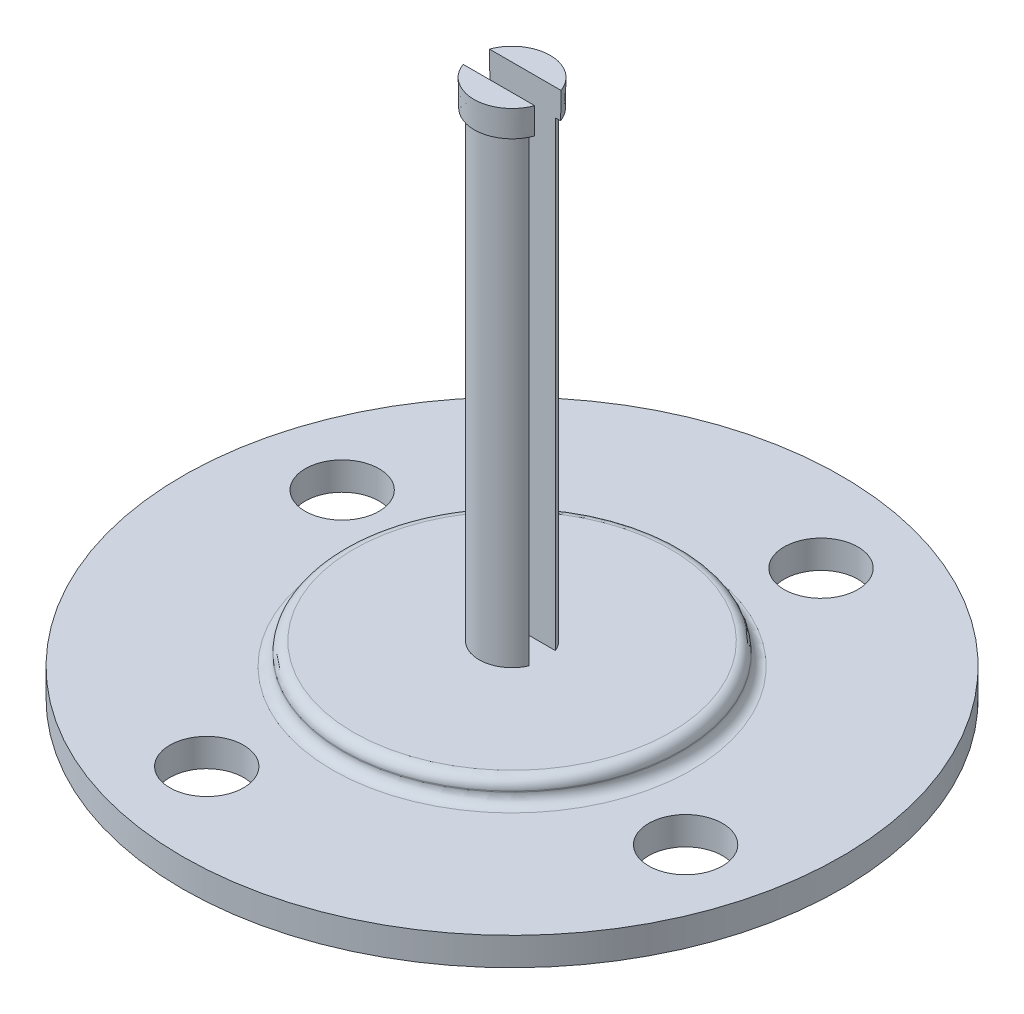
ISO-10303-21;
HEADER;
FILE_DESCRIPTION(('STEP AP214'),'2;1');
FILE_NAME('part.step','',(''),(''),'','','');
FILE_SCHEMA(('AUTOMOTIVE_DESIGN { 1 0 10303 214 1 1 1 1 }'));
ENDSEC;
DATA;
#1=APPLICATION_CONTEXT('core data for automotive mechanical design processes');
#2=APPLICATION_PROTOCOL_DEFINITION('international standard','automotive_design',2000,#1);
#3=PRODUCT_CONTEXT('',#1,'mechanical');
#4=PRODUCT('Part','Part','',(#3));
#5=PRODUCT_RELATED_PRODUCT_CATEGORY('part','',(#4));
#6=PRODUCT_DEFINITION_FORMATION('','',#4);
#7=PRODUCT_DEFINITION_CONTEXT('part definition',#1,'design');
#8=PRODUCT_DEFINITION('design','',#6,#7);
#9=PRODUCT_DEFINITION_SHAPE('','',#8);
#10=(LENGTH_UNIT() NAMED_UNIT(*) SI_UNIT(.MILLI.,.METRE.));
#11=(NAMED_UNIT(*) PLANE_ANGLE_UNIT() SI_UNIT($,.RADIAN.));
#12=(NAMED_UNIT(*) SI_UNIT($,.STERADIAN.) SOLID_ANGLE_UNIT());
#13=UNCERTAINTY_MEASURE_WITH_UNIT(LENGTH_MEASURE(1.E-05),#10,'distance_accuracy_value','');
#14=(GEOMETRIC_REPRESENTATION_CONTEXT(3) GLOBAL_UNCERTAINTY_ASSIGNED_CONTEXT((#13)) GLOBAL_UNIT_ASSIGNED_CONTEXT((#10,
#11,#12)) REPRESENTATION_CONTEXT('',''));
#15=CARTESIAN_POINT('',(0.,0.,0.));
#16=DIRECTION('',(0.,0.,1.));
#17=DIRECTION('',(1.,0.,0.));
#18=AXIS2_PLACEMENT_3D('',#15,#16,#17);
#19=CARTESIAN_POINT('',(-0.172820682432746,49.6391226221658,0.));
#20=DIRECTION('',(0.,1.,0.));
#21=DIRECTION('',(0.,0.,1.));
#22=AXIS2_PLACEMENT_3D('',#19,#20,#21);
#23=PLANE('',#22);
#24=CARTESIAN_POINT('',(-0.172820682432746,49.6391226221658,0.));
#25=DIRECTION('',(0.,1.,0.));
#26=DIRECTION('',(0.,0.,1.));
#27=AXIS2_PLACEMENT_3D('',#24,#25,#26);
#28=CIRCLE('',#27,3.67588377709907);
#29=CARTESIAN_POINT('',(3.27670414611105,49.6391226221658,-1.27));
#30=VERTEX_POINT('',#29);
#31=CARTESIAN_POINT('',(-3.62234551097654,49.6391226221658,-1.27));
#32=VERTEX_POINT('',#31);
#33=EDGE_CURVE('E136',#30,#32,#28,.T.);
#34=ORIENTED_EDGE('',*,*,#33,.T.);
#35=DIRECTION('',(1.,0.,0.));
#36=VECTOR('',#35,1.);
#37=CARTESIAN_POINT('',(-0.172820682432746,49.6391226221658,-1.27));
#38=LINE('',#37,#36);
#39=EDGE_CURVE('E449',#32,#30,#38,.T.);
#40=ORIENTED_EDGE('',*,*,#39,.T.);
#41=EDGE_LOOP('',(#34,#40));
#42=FACE_BOUND('',#41,.T.);
#43=ADVANCED_FACE('F35',(#42),#23,.T.);
#44=CARTESIAN_POINT('',(-0.172820682432746,49.6391226221658,0.));
#45=DIRECTION('',(0.,1.,0.));
#46=DIRECTION('',(0.,0.,1.));
#47=AXIS2_PLACEMENT_3D('',#44,#45,#46);
#48=CONICAL_SURFACE('',#47,3.67588377709907,0.015007533269726);
#49=CARTESIAN_POINT('',(-0.172820682432746,47.0814316097973,0.));
#50=DIRECTION('',(0.,1.,0.));
#51=DIRECTION('',(0.,0.,1.));
#52=AXIS2_PLACEMENT_3D('',#49,#50,#51);
#53=CIRCLE('',#52,3.63749626213781);
#54=CARTESIAN_POINT('',(3.23576833020379,47.0814316097973,-1.27));
#55=VERTEX_POINT('',#54);
#56=CARTESIAN_POINT('',(-3.58140969506929,47.0814316097973,-1.27));
#57=VERTEX_POINT('',#56);
#58=EDGE_CURVE('E132',#55,#57,#53,.T.);
#59=ORIENTED_EDGE('',*,*,#58,.T.);
#60=CARTESIAN_POINT('',(-3.48616510335539,41.1451896661133,-1.27));
#61=CARTESIAN_POINT('',(-3.52475724587845,43.5465206001131,-1.27));
#62=CARTESIAN_POINT('',(-3.563271365335,45.9478527829617,-1.27));
#63=CARTESIAN_POINT('',(-3.64014355811235,50.7505196461857,-1.27));
#64=CARTESIAN_POINT('',(-3.67850163143315,53.1518543265611,-1.27));
#65=CARTESIAN_POINT('',(-3.71678168168746,55.5531902557853,-1.27));
#66=B_SPLINE_CURVE_WITH_KNOTS('',3,(#60,#61,#62,#63,#64,#65),.UNSPECIFIED.,.F.,.F.,(4,2,4),(0.,
7.20492306052159,14.4098461205316),.UNSPECIFIED.);
#67=EDGE_CURVE('E447',#57,#32,#66,.T.);
#68=ORIENTED_EDGE('',*,*,#67,.T.);
#69=ORIENTED_EDGE('',*,*,#33,.F.);
#70=CARTESIAN_POINT('',(3.37114031682196,55.5531902557853,-1.27));
#71=CARTESIAN_POINT('',(3.33286026656766,53.1518543265611,-1.27));
#72=CARTESIAN_POINT('',(3.29450219324685,50.7505196461857,-1.27));
#73=CARTESIAN_POINT('',(3.21763000046951,45.9478527829617,-1.27));
#74=CARTESIAN_POINT('',(3.17911588101296,43.5465206001131,-1.27));
#75=CARTESIAN_POINT('',(3.1405237384899,41.1451896661133,-1.27));
#76=B_SPLINE_CURVE_WITH_KNOTS('',3,(#70,#71,#72,#73,#74,#75),.UNSPECIFIED.,.F.,.F.,(4,2,4),(0.,
7.20492306001003,14.4098461205316),.UNSPECIFIED.);
#77=EDGE_CURVE('E242',#30,#55,#76,.T.);
#78=ORIENTED_EDGE('',*,*,#77,.T.);
#79=EDGE_LOOP('',(#59,#68,#69,#78));
#80=FACE_BOUND('',#79,.T.);
#81=ADVANCED_FACE('F174',(#80),#48,.T.);
#82=CARTESIAN_POINT('',(3.46467557970506,47.0814316097973,0.));
#83=DIRECTION('',(0.,-1.,0.));
#84=DIRECTION('',(0.,0.,-1.));
#85=AXIS2_PLACEMENT_3D('',#82,#83,#84);
#86=PLANE('',#85);
#87=ORIENTED_EDGE('',*,*,#58,.F.);
#88=DIRECTION('',(-1.,0.,0.));
#89=VECTOR('',#88,1.);
#90=CARTESIAN_POINT('',(3.46467557970506,47.0814316097973,-1.27));
#91=LINE('',#90,#89);
#92=CARTESIAN_POINT('',(2.73711488386421,47.0814316097973,-1.27));
#93=VERTEX_POINT('',#92);
#94=EDGE_CURVE('E237',#55,#93,#91,.T.);
#95=ORIENTED_EDGE('',*,*,#94,.T.);
#96=CARTESIAN_POINT('',(-0.172820682432746,47.0814316097973,0.));
#97=DIRECTION('',(0.,1.,0.));
#98=DIRECTION('',(0.,0.,1.));
#99=AXIS2_PLACEMENT_3D('',#96,#97,#98);
#100=CIRCLE('',#99,3.175);
#101=CARTESIAN_POINT('',(-3.08275624872971,47.0814316097973,-1.27));
#102=VERTEX_POINT('',#101);
#103=EDGE_CURVE('E128',#93,#102,#100,.T.);
#104=ORIENTED_EDGE('',*,*,#103,.T.);
#105=EDGE_CURVE('E244',#102,#57,#91,.T.);
#106=ORIENTED_EDGE('',*,*,#105,.T.);
#107=EDGE_LOOP('',(#87,#95,#104,#106));
#108=FACE_BOUND('',#107,.T.);
#109=ADVANCED_FACE('F181',(#108),#86,.T.);
#110=CARTESIAN_POINT('',(-0.172820682432746,49.6391226221658,0.));
#111=DIRECTION('',(0.,1.,0.));
#112=DIRECTION('',(0.,0.,1.));
#113=AXIS2_PLACEMENT_3D('',#110,#111,#112);
#114=CYLINDRICAL_SURFACE('',#113,3.175);
#115=ORIENTED_EDGE('',*,*,#103,.F.);
#116=DIRECTION('',(0.,1.,0.));
#117=VECTOR('',#116,1.);
#118=CARTESIAN_POINT('',(2.73711488386422,49.6391226221658,-1.27));
#119=LINE('',#118,#117);
#120=CARTESIAN_POINT('',(2.73711488386422,2.63143160979726,-1.27));
#121=VERTEX_POINT('',#120);
#122=EDGE_CURVE('E58',#93,#121,#119,.F.);
#123=ORIENTED_EDGE('',*,*,#122,.T.);
#124=CARTESIAN_POINT('',(-0.172820682432746,2.63143160979727,0.));
#125=DIRECTION('',(0.,1.,0.));
#126=DIRECTION('',(0.,0.,1.));
#127=AXIS2_PLACEMENT_3D('',#124,#125,#126);
#128=CIRCLE('',#127,3.17500000000001);
#129=CARTESIAN_POINT('',(-3.08275624872971,2.63143160979726,-1.27));
#130=VERTEX_POINT('',#129);
#131=EDGE_CURVE('E117',#121,#130,#128,.T.);
#132=ORIENTED_EDGE('',*,*,#131,.T.);
#133=DIRECTION('',(0.,1.,0.));
#134=VECTOR('',#133,1.);
#135=CARTESIAN_POINT('',(-3.08275624872971,49.6391226221658,-1.27));
#136=LINE('',#135,#134);
#137=EDGE_CURVE('E106',#130,#102,#136,.T.);
#138=ORIENTED_EDGE('',*,*,#137,.T.);
#139=EDGE_LOOP('',(#115,#123,#132,#138));
#140=FACE_BOUND('',#139,.T.);
#141=ADVANCED_FACE('F172',(#140),#114,.T.);
#142=CARTESIAN_POINT('',(-0.172820682432746,-2.19433086517551,0.));
#143=DIRECTION('',(0.,1.,0.));
#144=DIRECTION('',(0.,0.,1.));
#145=AXIS2_PLACEMENT_3D('',#142,#143,#144);
#146=PLANE('',#145);
#147=CARTESIAN_POINT('',(6.52282068243275,-2.19433086517551,-23.0649190444225));
#148=DIRECTION('',(0.,1.,0.));
#149=DIRECTION('',(0.,0.,1.));
#150=AXIS2_PLACEMENT_3D('',#147,#148,#149);
#151=CIRCLE('',#150,3.556);
#152=CARTESIAN_POINT('',(6.52282068243275,-2.19433086517551,-19.5089190444225));
#153=VERTEX_POINT('',#152);
#154=EDGE_CURVE('E254',#153,#153,#151,.F.);
#155=ORIENTED_EDGE('',*,*,#154,.F.);
#156=EDGE_LOOP('',(#155));
#157=FACE_BOUND('',#156,.T.);
#158=CARTESIAN_POINT('',(23.0649190444225,-2.19433086517551,6.52282068243275));
#159=DIRECTION('',(0.,1.,0.));
#160=DIRECTION('',(0.,0.,1.));
#161=AXIS2_PLACEMENT_3D('',#158,#159,#160);
#162=CIRCLE('',#161,3.556);
#163=CARTESIAN_POINT('',(23.0649190444225,-2.19433086517551,10.0788206824327));
#164=VERTEX_POINT('',#163);
#165=EDGE_CURVE('E255',#164,#164,#162,.F.);
#166=ORIENTED_EDGE('',*,*,#165,.F.);
#167=EDGE_LOOP('',(#166));
#168=FACE_BOUND('',#167,.T.);
#169=CARTESIAN_POINT('',(-6.52282068243275,-2.19433086517551,23.0649190444225));
#170=DIRECTION('',(0.,1.,0.));
#171=DIRECTION('',(0.,0.,1.));
#172=AXIS2_PLACEMENT_3D('',#169,#170,#171);
#173=CIRCLE('',#172,3.556);
#174=CARTESIAN_POINT('',(-6.52282068243275,-2.19433086517551,26.6209190444225));
#175=VERTEX_POINT('',#174);
#176=EDGE_CURVE('E240',#175,#175,#173,.F.);
#177=ORIENTED_EDGE('',*,*,#176,.F.);
#178=EDGE_LOOP('',(#177));
#179=FACE_BOUND('',#178,.T.);
#180=CARTESIAN_POINT('',(-23.0649190444225,-2.19433086517551,-6.52282068243275));
#181=DIRECTION('',(0.,1.,0.));
#182=DIRECTION('',(0.,0.,1.));
#183=AXIS2_PLACEMENT_3D('',#180,#181,#182);
#184=CIRCLE('',#183,3.556);
#185=CARTESIAN_POINT('',(-23.0649190444225,-2.19433086517551,-2.96682068243275));
#186=VERTEX_POINT('',#185);
#187=EDGE_CURVE('E268',#186,#186,#184,.F.);
#188=ORIENTED_EDGE('',*,*,#187,.F.);
#189=EDGE_LOOP('',(#188));
#190=FACE_BOUND('',#189,.T.);
#191=CARTESIAN_POINT('',(-0.172820682432746,-2.19433086517551,0.));
#192=DIRECTION('',(0.,1.,0.));
#193=DIRECTION('',(0.,0.,1.));
#194=AXIS2_PLACEMENT_3D('',#191,#192,#193);
#195=CIRCLE('',#194,31.75);
#196=CARTESIAN_POINT('',(-0.172820682432746,-2.19433086517551,31.75));
#197=VERTEX_POINT('',#196);
#198=EDGE_CURVE('E123',#197,#197,#195,.T.);
#199=ORIENTED_EDGE('',*,*,#198,.F.);
#200=EDGE_LOOP('',(#199));
#201=FACE_BOUND('',#200,.T.);
#202=ADVANCED_FACE('F188',(#157,#168,#179,#190,#201),#146,.F.);
#203=DIRECTION('',(1.,0.,0.));
#204=VECTOR('',#203,1.);
#205=CARTESIAN_POINT('',(-0.172820682432746,49.6391226221658,1.27));
#206=LINE('',#205,#204);
#207=CARTESIAN_POINT('',(-3.62234551097654,49.6391226221658,1.27));
#208=VERTEX_POINT('',#207);
#209=CARTESIAN_POINT('',(3.27670414611105,49.6391226221658,1.27));
#210=VERTEX_POINT('',#209);
#211=EDGE_CURVE('E197',#208,#210,#206,.T.);
#212=ORIENTED_EDGE('',*,*,#211,.F.);
#213=EDGE_CURVE('E133',#208,#210,#28,.T.);
#214=ORIENTED_EDGE('',*,*,#213,.T.);
#215=EDGE_LOOP('',(#212,#214));
#216=FACE_BOUND('',#215,.T.);
#217=ADVANCED_FACE('F177',(#216),#23,.T.);
#218=CARTESIAN_POINT('',(-3.48616510335539,41.1451896661133,1.27));
#219=CARTESIAN_POINT('',(-3.52475724587845,43.5465206001131,1.27));
#220=CARTESIAN_POINT('',(-3.563271365335,45.9478527829617,1.27));
#221=CARTESIAN_POINT('',(-3.64014355811235,50.7505196461857,1.27));
#222=CARTESIAN_POINT('',(-3.67850163143315,53.1518543265611,1.27));
#223=CARTESIAN_POINT('',(-3.71678168168746,55.5531902557853,1.27));
#224=B_SPLINE_CURVE_WITH_KNOTS('',3,(#218,#219,#220,#221,#222,#223),.UNSPECIFIED.,.F.,.F.,(4,2,
4),(0.,7.20492306052159,14.4098461205316),.UNSPECIFIED.);
#225=CARTESIAN_POINT('',(-3.58140969506929,47.0814316097973,1.27));
#226=VERTEX_POINT('',#225);
#227=EDGE_CURVE('E201',#226,#208,#224,.T.);
#228=ORIENTED_EDGE('',*,*,#227,.F.);
#229=CARTESIAN_POINT('',(3.23576833020379,47.0814316097973,1.27));
#230=VERTEX_POINT('',#229);
#231=EDGE_CURVE('E129',#226,#230,#53,.T.);
#232=ORIENTED_EDGE('',*,*,#231,.T.);
#233=CARTESIAN_POINT('',(3.37114031682196,55.5531902557853,1.27));
#234=CARTESIAN_POINT('',(3.33286026656766,53.1518543265611,1.27));
#235=CARTESIAN_POINT('',(3.29450219324685,50.7505196461857,1.27));
#236=CARTESIAN_POINT('',(3.21763000046951,45.9478527829617,1.27));
#237=CARTESIAN_POINT('',(3.17911588101296,43.5465206001131,1.27));
#238=CARTESIAN_POINT('',(3.1405237384899,41.1451896661133,1.27));
#239=B_SPLINE_CURVE_WITH_KNOTS('',3,(#233,#234,#235,#236,#237,#238),.UNSPECIFIED.,.F.,.F.,(4,2,
4),(0.,7.20492306001003,14.4098461205316),.UNSPECIFIED.);
#240=EDGE_CURVE('E200',#210,#230,#239,.T.);
#241=ORIENTED_EDGE('',*,*,#240,.F.);
#242=ORIENTED_EDGE('',*,*,#213,.F.);
#243=EDGE_LOOP('',(#228,#232,#241,#242));
#244=FACE_BOUND('',#243,.T.);
#245=ADVANCED_FACE('F184',(#244),#48,.T.);
#246=DIRECTION('',(-1.,0.,0.));
#247=VECTOR('',#246,1.);
#248=CARTESIAN_POINT('',(3.46467557970506,47.0814316097973,1.27));
#249=LINE('',#248,#247);
#250=CARTESIAN_POINT('',(2.73711488386421,47.0814316097973,1.27));
#251=VERTEX_POINT('',#250);
#252=EDGE_CURVE('E101',#230,#251,#249,.T.);
#253=ORIENTED_EDGE('',*,*,#252,.F.);
#254=ORIENTED_EDGE('',*,*,#231,.F.);
#255=CARTESIAN_POINT('',(-3.08275624872971,47.0814316097973,1.27));
#256=VERTEX_POINT('',#255);
#257=EDGE_CURVE('E207',#256,#226,#249,.T.);
#258=ORIENTED_EDGE('',*,*,#257,.F.);
#259=EDGE_CURVE('E121',#256,#251,#100,.T.);
#260=ORIENTED_EDGE('',*,*,#259,.T.);
#261=EDGE_LOOP('',(#253,#254,#258,#260));
#262=FACE_BOUND('',#261,.T.);
#263=ADVANCED_FACE('F170',(#262),#86,.T.);
#264=DIRECTION('',(0.,1.,0.));
#265=VECTOR('',#264,1.);
#266=CARTESIAN_POINT('',(2.73711488386422,49.6391226221658,1.27));
#267=LINE('',#266,#265);
#268=CARTESIAN_POINT('',(2.73711488386422,2.63143160979726,1.27));
#269=VERTEX_POINT('',#268);
#270=EDGE_CURVE('E98',#251,#269,#267,.F.);
#271=ORIENTED_EDGE('',*,*,#270,.F.);
#272=ORIENTED_EDGE('',*,*,#259,.F.);
#273=DIRECTION('',(0.,1.,0.));
#274=VECTOR('',#273,1.);
#275=CARTESIAN_POINT('',(-3.08275624872971,49.6391226221658,1.27));
#276=LINE('',#275,#274);
#277=CARTESIAN_POINT('',(-3.08275624872971,2.63143160979727,1.27));
#278=VERTEX_POINT('',#277);
#279=EDGE_CURVE('E116',#278,#256,#276,.T.);
#280=ORIENTED_EDGE('',*,*,#279,.F.);
#281=EDGE_CURVE('E112',#278,#269,#128,.T.);
#282=ORIENTED_EDGE('',*,*,#281,.T.);
#283=EDGE_LOOP('',(#271,#272,#280,#282));
#284=FACE_BOUND('',#283,.T.);
#285=ADVANCED_FACE('F115',(#284),#114,.T.);
#286=CARTESIAN_POINT('',(3.00217931756726,2.63143160979727,0.));
#287=DIRECTION('',(0.,1.,0.));
#288=DIRECTION('',(0.,0.,1.));
#289=AXIS2_PLACEMENT_3D('',#286,#287,#288);
#290=PLANE('',#289);
#291=ORIENTED_EDGE('',*,*,#281,.F.);
#292=DIRECTION('',(1.,0.,0.));
#293=VECTOR('',#292,1.);
#294=CARTESIAN_POINT('',(-70.1388237305096,2.63143160979727,1.27));
#295=LINE('',#294,#293);
#296=EDGE_CURVE('E50',#278,#269,#295,.T.);
#297=ORIENTED_EDGE('',*,*,#296,.T.);
#298=EDGE_LOOP('',(#291,#297));
#299=FACE_BOUND('',#298,.T.);
#300=DIRECTION('',(1.,0.,0.));
#301=VECTOR('',#300,1.);
#302=CARTESIAN_POINT('',(-70.1388237305096,2.63143160979727,-1.27));
#303=LINE('',#302,#301);
#304=EDGE_CURVE('E113',#130,#121,#303,.T.);
#305=ORIENTED_EDGE('',*,*,#304,.F.);
#306=ORIENTED_EDGE('',*,*,#131,.F.);
#307=EDGE_LOOP('',(#305,#306));
#308=FACE_BOUND('',#307,.T.);
#309=CARTESIAN_POINT('',(-0.172820682432746,2.63143160979727,0.));
#310=DIRECTION('',(0.,1.,0.));
#311=DIRECTION('',(0.,0.,1.));
#312=AXIS2_PLACEMENT_3D('',#309,#310,#311);
#313=CIRCLE('',#312,15.2782265790262);
#314=CARTESIAN_POINT('',(-0.172820682432746,2.63143160979727,15.2782265790262));
#315=VERTEX_POINT('',#314);
#316=EDGE_CURVE('E11',#315,#315,#313,.T.);
#317=ORIENTED_EDGE('',*,*,#316,.T.);
#318=EDGE_LOOP('',(#317));
#319=FACE_BOUND('',#318,.T.);
#320=ADVANCED_FACE('F110',(#299,#308,#319),#290,.T.);
#321=CARTESIAN_POINT('',(-0.172820682432746,49.6391226221658,0.));
#322=DIRECTION('',(0.,1.,0.));
#323=DIRECTION('',(0.,0.,1.));
#324=AXIS2_PLACEMENT_3D('',#321,#322,#323);
#325=CYLINDRICAL_SURFACE('',#324,16.2942265790262);
#326=CARTESIAN_POINT('',(-0.172820682432746,1.52281752939142,0.));
#327=DIRECTION('',(0.,1.,0.));
#328=DIRECTION('',(0.,0.,1.));
#329=AXIS2_PLACEMENT_3D('',#326,#327,#328);
#330=CIRCLE('',#329,16.2942265790262);
#331=CARTESIAN_POINT('',(-0.172820682432746,1.52281752939142,16.2942265790262));
#332=VERTEX_POINT('',#331);
#333=EDGE_CURVE('E140',#332,#332,#330,.T.);
#334=ORIENTED_EDGE('',*,*,#333,.T.);
#335=EDGE_LOOP('',(#334));
#336=FACE_BOUND('',#335,.T.);
#337=CARTESIAN_POINT('',(-0.172820682432746,1.61543160979727,0.));
#338=DIRECTION('',(0.,1.,0.));
#339=DIRECTION('',(0.,0.,1.));
#340=AXIS2_PLACEMENT_3D('',#337,#338,#339);
#341=CIRCLE('',#340,16.2942265790262);
#342=CARTESIAN_POINT('',(-0.172820682432746,1.61543160979727,16.2942265790262));
#343=VERTEX_POINT('',#342);
#344=EDGE_CURVE('E137',#343,#343,#341,.F.);
#345=ORIENTED_EDGE('',*,*,#344,.T.);
#346=EDGE_LOOP('',(#345));
#347=FACE_BOUND('',#346,.T.);
#348=ADVANCED_FACE('F154',(#336,#347),#325,.T.);
#349=CARTESIAN_POINT('',(16.1214058965934,0.506817529391413,0.));
#350=DIRECTION('',(0.,1.,0.));
#351=DIRECTION('',(0.,0.,1.));
#352=AXIS2_PLACEMENT_3D('',#349,#350,#351);
#353=PLANE('',#352);
#354=CARTESIAN_POINT('',(6.52282068243275,0.506817529391413,-23.0649190444225));
#355=DIRECTION('',(0.,1.,0.));
#356=DIRECTION('',(0.,0.,1.));
#357=AXIS2_PLACEMENT_3D('',#354,#355,#356);
#358=CIRCLE('',#357,3.556);
#359=CARTESIAN_POINT('',(6.52282068243275,0.506817529391413,-19.5089190444225));
#360=VERTEX_POINT('',#359);
#361=EDGE_CURVE('E251',#360,#360,#358,.T.);
#362=ORIENTED_EDGE('',*,*,#361,.F.);
#363=EDGE_LOOP('',(#362));
#364=FACE_BOUND('',#363,.T.);
#365=CARTESIAN_POINT('',(23.0649190444225,0.506817529391413,6.52282068243275));
#366=DIRECTION('',(0.,1.,0.));
#367=DIRECTION('',(0.,0.,1.));
#368=AXIS2_PLACEMENT_3D('',#365,#366,#367);
#369=CIRCLE('',#368,3.556);
#370=CARTESIAN_POINT('',(23.0649190444225,0.506817529391413,10.0788206824327));
#371=VERTEX_POINT('',#370);
#372=EDGE_CURVE('E259',#371,#371,#369,.T.);
#373=ORIENTED_EDGE('',*,*,#372,.F.);
#374=EDGE_LOOP('',(#373));
#375=FACE_BOUND('',#374,.T.);
#376=CARTESIAN_POINT('',(-6.52282068243275,0.506817529391413,23.0649190444225));
#377=DIRECTION('',(0.,1.,0.));
#378=DIRECTION('',(0.,0.,1.));
#379=AXIS2_PLACEMENT_3D('',#376,#377,#378);
#380=CIRCLE('',#379,3.556);
#381=CARTESIAN_POINT('',(-6.52282068243275,0.506817529391413,26.6209190444225));
#382=VERTEX_POINT('',#381);
#383=EDGE_CURVE('E236',#382,#382,#380,.T.);
#384=ORIENTED_EDGE('',*,*,#383,.F.);
#385=EDGE_LOOP('',(#384));
#386=FACE_BOUND('',#385,.T.);
#387=CARTESIAN_POINT('',(-23.0649190444225,0.506817529391413,-6.52282068243275));
#388=DIRECTION('',(0.,1.,0.));
#389=DIRECTION('',(0.,0.,1.));
#390=AXIS2_PLACEMENT_3D('',#387,#388,#389);
#391=CIRCLE('',#390,3.556);
#392=CARTESIAN_POINT('',(-23.0649190444225,0.506817529391413,-2.96682068243275));
#393=VERTEX_POINT('',#392);
#394=EDGE_CURVE('E258',#393,#393,#391,.T.);
#395=ORIENTED_EDGE('',*,*,#394,.F.);
#396=EDGE_LOOP('',(#395));
#397=FACE_BOUND('',#396,.T.);
#398=CARTESIAN_POINT('',(-0.172820682432746,0.506817529391413,0.));
#399=DIRECTION('',(0.,1.,0.));
#400=DIRECTION('',(0.,0.,1.));
#401=AXIS2_PLACEMENT_3D('',#398,#399,#400);
#402=CIRCLE('',#401,17.3102265790262);
#403=CARTESIAN_POINT('',(-0.172820682432746,0.506817529391413,17.3102265790262));
#404=VERTEX_POINT('',#403);
#405=EDGE_CURVE('E43',#404,#404,#402,.F.);
#406=ORIENTED_EDGE('',*,*,#405,.T.);
#407=EDGE_LOOP('',(#406));
#408=FACE_BOUND('',#407,.T.);
#409=CARTESIAN_POINT('',(-0.172820682432746,0.506817529391412,0.));
#410=DIRECTION('',(0.,1.,0.));
#411=DIRECTION('',(0.,0.,1.));
#412=AXIS2_PLACEMENT_3D('',#409,#410,#411);
#413=CIRCLE('',#412,31.75);
#414=CARTESIAN_POINT('',(-0.172820682432746,0.506817529391412,31.75));
#415=VERTEX_POINT('',#414);
#416=EDGE_CURVE('E118',#415,#415,#413,.T.);
#417=ORIENTED_EDGE('',*,*,#416,.T.);
#418=EDGE_LOOP('',(#417));
#419=FACE_BOUND('',#418,.T.);
#420=ADVANCED_FACE('F145',(#364,#375,#386,#397,#408,#419),#353,.T.);
#421=CARTESIAN_POINT('',(-0.172820682432746,49.6391226221658,0.));
#422=DIRECTION('',(0.,1.,0.));
#423=DIRECTION('',(0.,0.,1.));
#424=AXIS2_PLACEMENT_3D('',#421,#422,#423);
#425=CYLINDRICAL_SURFACE('',#424,31.75);
#426=ORIENTED_EDGE('',*,*,#198,.T.);
#427=EDGE_LOOP('',(#426));
#428=FACE_BOUND('',#427,.T.);
#429=ORIENTED_EDGE('',*,*,#416,.F.);
#430=EDGE_LOOP('',(#429));
#431=FACE_BOUND('',#430,.T.);
#432=ADVANCED_FACE('F151',(#428,#431),#425,.T.);
#433=CARTESIAN_POINT('',(-0.172820682432746,1.52281752939142,0.));
#434=DIRECTION('',(0.,1.,0.));
#435=DIRECTION('',(0.,0.,1.));
#436=AXIS2_PLACEMENT_3D('',#433,#434,#435);
#437=TOROIDAL_SURFACE('',#436,17.3102265790262,1.016);
#438=ORIENTED_EDGE('',*,*,#405,.F.);
#439=EDGE_LOOP('',(#438));
#440=FACE_BOUND('',#439,.T.);
#441=ORIENTED_EDGE('',*,*,#333,.F.);
#442=EDGE_LOOP('',(#441));
#443=FACE_BOUND('',#442,.T.);
#444=ADVANCED_FACE('F148',(#440,#443),#437,.F.);
#445=CARTESIAN_POINT('',(-0.172820682432746,1.61543160979727,0.));
#446=DIRECTION('',(0.,1.,0.));
#447=DIRECTION('',(0.,0.,1.));
#448=AXIS2_PLACEMENT_3D('',#445,#446,#447);
#449=TOROIDAL_SURFACE('',#448,15.2782265790262,1.016);
#450=ORIENTED_EDGE('',*,*,#344,.F.);
#451=EDGE_LOOP('',(#450));
#452=FACE_BOUND('',#451,.T.);
#453=ORIENTED_EDGE('',*,*,#316,.F.);
#454=EDGE_LOOP('',(#453));
#455=FACE_BOUND('',#454,.T.);
#456=ADVANCED_FACE('F37',(#452,#455),#449,.T.);
#457=CARTESIAN_POINT('',(-23.0649190444225,-12.252217720773,-6.52282068243275));
#458=DIRECTION('',(0.,1.,0.));
#459=DIRECTION('',(0.,0.,1.));
#460=AXIS2_PLACEMENT_3D('',#457,#458,#459);
#461=CYLINDRICAL_SURFACE('',#460,3.556);
#462=ORIENTED_EDGE('',*,*,#187,.T.);
#463=EDGE_LOOP('',(#462));
#464=FACE_BOUND('',#463,.T.);
#465=ORIENTED_EDGE('',*,*,#394,.T.);
#466=EDGE_LOOP('',(#465));
#467=FACE_BOUND('',#466,.T.);
#468=ADVANCED_FACE('F162',(#464,#467),#461,.F.);
#469=CARTESIAN_POINT('',(-6.52282068243275,-12.252217720773,23.0649190444225));
#470=DIRECTION('',(0.,1.,0.));
#471=DIRECTION('',(0.,0.,1.));
#472=AXIS2_PLACEMENT_3D('',#469,#470,#471);
#473=CYLINDRICAL_SURFACE('',#472,3.556);
#474=ORIENTED_EDGE('',*,*,#176,.T.);
#475=EDGE_LOOP('',(#474));
#476=FACE_BOUND('',#475,.T.);
#477=ORIENTED_EDGE('',*,*,#383,.T.);
#478=EDGE_LOOP('',(#477));
#479=FACE_BOUND('',#478,.T.);
#480=ADVANCED_FACE('F288',(#476,#479),#473,.F.);
#481=CARTESIAN_POINT('',(23.0649190444225,-12.252217720773,6.52282068243275));
#482=DIRECTION('',(0.,1.,0.));
#483=DIRECTION('',(0.,0.,1.));
#484=AXIS2_PLACEMENT_3D('',#481,#482,#483);
#485=CYLINDRICAL_SURFACE('',#484,3.556);
#486=ORIENTED_EDGE('',*,*,#165,.T.);
#487=EDGE_LOOP('',(#486));
#488=FACE_BOUND('',#487,.T.);
#489=ORIENTED_EDGE('',*,*,#372,.T.);
#490=EDGE_LOOP('',(#489));
#491=FACE_BOUND('',#490,.T.);
#492=ADVANCED_FACE('F291',(#488,#491),#485,.F.);
#493=CARTESIAN_POINT('',(6.52282068243275,-12.252217720773,-23.0649190444225));
#494=DIRECTION('',(0.,1.,0.));
#495=DIRECTION('',(0.,0.,1.));
#496=AXIS2_PLACEMENT_3D('',#493,#494,#495);
#497=CYLINDRICAL_SURFACE('',#496,3.556);
#498=ORIENTED_EDGE('',*,*,#154,.T.);
#499=EDGE_LOOP('',(#498));
#500=FACE_BOUND('',#499,.T.);
#501=ORIENTED_EDGE('',*,*,#361,.T.);
#502=EDGE_LOOP('',(#501));
#503=FACE_BOUND('',#502,.T.);
#504=ADVANCED_FACE('F222',(#500,#503),#497,.F.);
#505=CARTESIAN_POINT('',(0.,0.,-1.27));
#506=DIRECTION('',(0.,0.,1.));
#507=DIRECTION('',(1.,0.,0.));
#508=AXIS2_PLACEMENT_3D('',#505,#506,#507);
#509=PLANE('',#508);
#510=ORIENTED_EDGE('',*,*,#94,.F.);
#511=ORIENTED_EDGE('',*,*,#77,.F.);
#512=ORIENTED_EDGE('',*,*,#39,.F.);
#513=ORIENTED_EDGE('',*,*,#67,.F.);
#514=ORIENTED_EDGE('',*,*,#105,.F.);
#515=ORIENTED_EDGE('',*,*,#137,.F.);
#516=ORIENTED_EDGE('',*,*,#304,.T.);
#517=ORIENTED_EDGE('',*,*,#122,.F.);
#518=EDGE_LOOP('',(#510,#511,#512,#513,#514,#515,#516,#517));
#519=FACE_BOUND('',#518,.T.);
#520=ADVANCED_FACE('F220',(#519),#509,.T.);
#521=CARTESIAN_POINT('',(0.,0.,1.27));
#522=DIRECTION('',(0.,0.,1.));
#523=DIRECTION('',(1.,0.,0.));
#524=AXIS2_PLACEMENT_3D('',#521,#522,#523);
#525=PLANE('',#524);
#526=ORIENTED_EDGE('',*,*,#270,.T.);
#527=ORIENTED_EDGE('',*,*,#296,.F.);
#528=ORIENTED_EDGE('',*,*,#279,.T.);
#529=ORIENTED_EDGE('',*,*,#257,.T.);
#530=ORIENTED_EDGE('',*,*,#227,.T.);
#531=ORIENTED_EDGE('',*,*,#211,.T.);
#532=ORIENTED_EDGE('',*,*,#240,.T.);
#533=ORIENTED_EDGE('',*,*,#252,.T.);
#534=EDGE_LOOP('',(#526,#527,#528,#529,#530,#531,#532,#533));
#535=FACE_BOUND('',#534,.T.);
#536=ADVANCED_FACE('F99',(#535),#525,.F.);
#537=CLOSED_SHELL('',(#43,#81,#109,#141,#202,#217,#245,#263,#285,#320,#348,#420,#432,#444,#456,
#468,#480,#492,#504,#520,#536));
#538=MANIFOLD_SOLID_BREP('B2',#537);
#539=ADVANCED_BREP_SHAPE_REPRESENTATION('',(#18,#538),#14);
#540=SHAPE_DEFINITION_REPRESENTATION(#9,#539);
ENDSEC;
END-ISO-10303-21;
